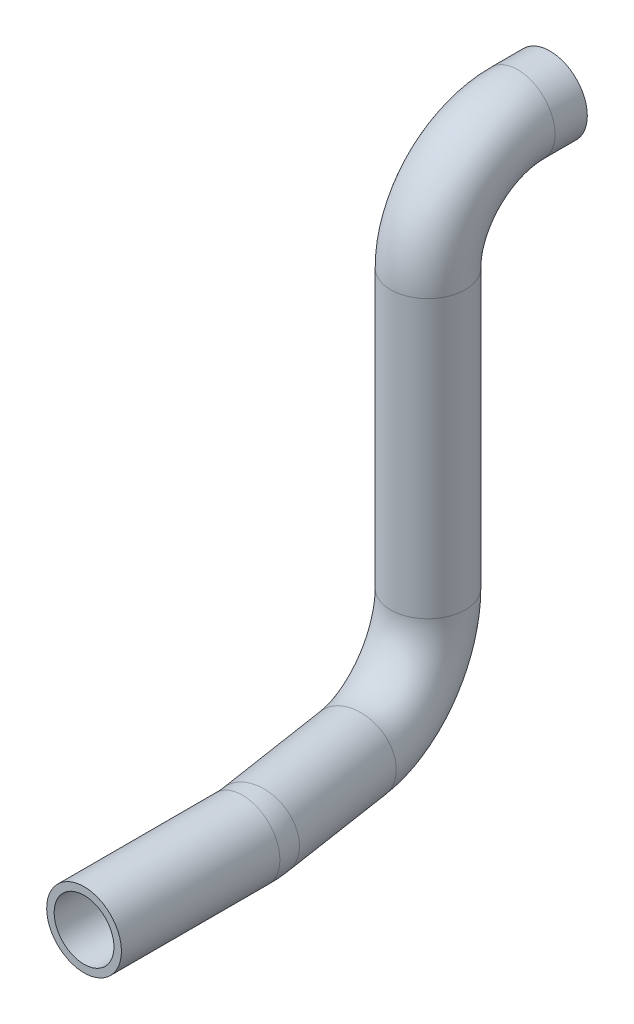
ISO-10303-21;
HEADER;
FILE_DESCRIPTION(('STEP AP214'),'2;1');
FILE_NAME('part.step','',(''),(''),'','','');
FILE_SCHEMA(('AUTOMOTIVE_DESIGN { 1 0 10303 214 1 1 1 1 }'));
ENDSEC;
DATA;
#1=APPLICATION_CONTEXT('core data for automotive mechanical design processes');
#2=APPLICATION_PROTOCOL_DEFINITION('international standard','automotive_design',2000,#1);
#3=PRODUCT_CONTEXT('',#1,'mechanical');
#4=PRODUCT('Part','Part','',(#3));
#5=PRODUCT_RELATED_PRODUCT_CATEGORY('part','',(#4));
#6=PRODUCT_DEFINITION_FORMATION('','',#4);
#7=PRODUCT_DEFINITION_CONTEXT('part definition',#1,'design');
#8=PRODUCT_DEFINITION('design','',#6,#7);
#9=PRODUCT_DEFINITION_SHAPE('','',#8);
#10=(LENGTH_UNIT() NAMED_UNIT(*) SI_UNIT(.MILLI.,.METRE.));
#11=(NAMED_UNIT(*) PLANE_ANGLE_UNIT() SI_UNIT($,.RADIAN.));
#12=(NAMED_UNIT(*) SI_UNIT($,.STERADIAN.) SOLID_ANGLE_UNIT());
#13=UNCERTAINTY_MEASURE_WITH_UNIT(LENGTH_MEASURE(1.E-05),#10,'distance_accuracy_value','');
#14=(GEOMETRIC_REPRESENTATION_CONTEXT(3) GLOBAL_UNCERTAINTY_ASSIGNED_CONTEXT((#13)) GLOBAL_UNIT_ASSIGNED_CONTEXT((#10,
#11,#12)) REPRESENTATION_CONTEXT('',''));
#15=CARTESIAN_POINT('',(0.,0.,0.));
#16=DIRECTION('',(0.,0.,1.));
#17=DIRECTION('',(1.,0.,0.));
#18=AXIS2_PLACEMENT_3D('',#15,#16,#17);
#19=CARTESIAN_POINT('',(-258.005382943833,120.353775534374,36.4238924269701));
#20=DIRECTION('',(0.,0.,1.));
#21=DIRECTION('',(1.,0.,0.));
#22=AXIS2_PLACEMENT_3D('',#19,#20,#21);
#23=CYLINDRICAL_SURFACE('',#22,6.34999999999999);
#24=CARTESIAN_POINT('',(-258.005382943833,120.353775534374,41.914927168532));
#25=DIRECTION('',(0.,0.,1.));
#26=DIRECTION('',(1.,0.,0.));
#27=AXIS2_PLACEMENT_3D('',#24,#25,#26);
#28=CIRCLE('',#27,6.34999999999999);
#29=CARTESIAN_POINT('',(-258.005382943833,126.703775534374,41.914927168532));
#30=VERTEX_POINT('',#29);
#31=EDGE_CURVE('E56',#30,#30,#28,.T.);
#32=ORIENTED_EDGE('',*,*,#31,.F.);
#33=EDGE_LOOP('',(#32));
#34=FACE_BOUND('',#33,.T.);
#35=CARTESIAN_POINT('',(-258.005382943833,120.353775534374,36.4238924269701));
#36=DIRECTION('',(0.,0.,1.));
#37=DIRECTION('',(1.,0.,0.));
#38=AXIS2_PLACEMENT_3D('',#35,#36,#37);
#39=CIRCLE('',#38,6.34999999999999);
#40=CARTESIAN_POINT('',(-251.655382943833,120.353775534374,36.4238924269701));
#41=VERTEX_POINT('',#40);
#42=EDGE_CURVE('E53',#41,#41,#39,.T.);
#43=ORIENTED_EDGE('',*,*,#42,.T.);
#44=EDGE_LOOP('',(#43));
#45=FACE_BOUND('',#44,.T.);
#46=ADVANCED_FACE('F32',(#34,#45),#23,.T.);
#47=CARTESIAN_POINT('',(-258.005382943833,105.113775534374,41.914927168532));
#48=DIRECTION('',(1.,0.,0.));
#49=DIRECTION('',(0.,0.,-1.));
#50=AXIS2_PLACEMENT_3D('',#47,#48,#49);
#51=TOROIDAL_SURFACE('',#50,15.24,6.34999999999999);
#52=CARTESIAN_POINT('',(-258.005382943833,105.113775534374,57.154927168532));
#53=DIRECTION('',(0.,-1.,0.));
#54=DIRECTION('',(1.,0.,0.));
#55=AXIS2_PLACEMENT_3D('',#52,#53,#54);
#56=CIRCLE('',#55,6.34999999999999);
#57=CARTESIAN_POINT('',(-258.005382943833,105.113775534374,63.504927168532));
#58=VERTEX_POINT('',#57);
#59=EDGE_CURVE('E59',#58,#58,#56,.T.);
#60=CARTESIAN_POINT('',(-258.005382943833,105.113775534374,41.914927168532));
#61=DIRECTION('',(1.,0.,0.));
#62=DIRECTION('',(0.,0.,-1.));
#63=AXIS2_PLACEMENT_3D('',#60,#61,#62);
#64=CIRCLE('',#63,21.59);
#65=EDGE_CURVE('',#30,#58,#64,.T.);
#66=ORIENTED_EDGE('',*,*,#31,.T.);
#67=ORIENTED_EDGE('',*,*,#59,.F.);
#68=ORIENTED_EDGE('',*,*,#65,.T.);
#69=ORIENTED_EDGE('',*,*,#65,.F.);
#70=EDGE_LOOP('',(#66,#68,#67,#69));
#71=FACE_BOUND('',#70,.T.);
#72=ADVANCED_FACE('F110',(#71),#51,.T.);
#73=CARTESIAN_POINT('',(-258.005382943833,105.113775534374,57.154927168532));
#74=DIRECTION('',(0.,-1.,0.));
#75=DIRECTION('',(0.,0.,-1.));
#76=AXIS2_PLACEMENT_3D('',#73,#74,#75);
#77=CYLINDRICAL_SURFACE('',#76,6.34999999999999);
#78=CARTESIAN_POINT('',(-258.005382943833,57.9916079515173,57.154927168532));
#79=DIRECTION('',(0.,-1.,0.));
#80=DIRECTION('',(1.,0.,0.));
#81=AXIS2_PLACEMENT_3D('',#78,#79,#80);
#82=CIRCLE('',#81,6.34999999999999);
#83=CARTESIAN_POINT('',(-259.070142182085,57.9916079515173,50.8948322998771));
#84=VERTEX_POINT('',#83);
#85=EDGE_CURVE('E62',#84,#84,#82,.T.);
#86=ORIENTED_EDGE('',*,*,#85,.F.);
#87=EDGE_LOOP('',(#86));
#88=FACE_BOUND('',#87,.T.);
#89=ORIENTED_EDGE('',*,*,#59,.T.);
#90=EDGE_LOOP('',(#89));
#91=FACE_BOUND('',#90,.T.);
#92=ADVANCED_FACE('F114',(#88,#91),#77,.T.);
#93=CARTESIAN_POINT('',(-255.44996077203,57.9916079515173,72.1791548533036));
#94=DIRECTION('',(-0.985841711599188,0.,0.167678620197043));
#95=DIRECTION('',(0.167678620197043,0.,0.985841711599188));
#96=AXIS2_PLACEMENT_3D('',#93,#94,#95);
#97=TOROIDAL_SURFACE('',#96,15.24,6.34999999999999);
#98=CARTESIAN_POINT('',(-255.402275814257,42.754261519815,72.4595115280774));
#99=DIRECTION('',(0.167649424221272,0.0186603052520301,0.985670058166614));
#100=DIRECTION('',(0.971359224953249,0.167649424221272,-0.168389211817443));
#101=AXIS2_PLACEMENT_3D('',#98,#99,#100);
#102=CIRCLE('',#101,6.34999999999999);
#103=CARTESIAN_POINT('',(-255.382407081851,36.4053671732724,72.5763268092332));
#104=VERTEX_POINT('',#103);
#105=EDGE_CURVE('E65',#104,#104,#102,.T.);
#106=CARTESIAN_POINT('',(-255.44996077203,57.9916079515173,72.1791548533036));
#107=DIRECTION('',(-0.985841711599188,0.,0.167678620197043));
#108=DIRECTION('',(0.167678620197043,0.,0.985841711599188));
#109=AXIS2_PLACEMENT_3D('',#106,#107,#108);
#110=CIRCLE('',#109,21.59);
#111=EDGE_CURVE('',#84,#104,#110,.T.);
#112=ORIENTED_EDGE('',*,*,#85,.T.);
#113=ORIENTED_EDGE('',*,*,#105,.F.);
#114=ORIENTED_EDGE('',*,*,#111,.T.);
#115=ORIENTED_EDGE('',*,*,#111,.F.);
#116=EDGE_LOOP('',(#112,#114,#113,#115));
#117=FACE_BOUND('',#116,.T.);
#118=ADVANCED_FACE('F84',(#117),#97,.T.);
#119=CARTESIAN_POINT('',(-255.402275814257,42.754261519815,72.4595115280774));
#120=DIRECTION('',(0.167649424221272,0.0186603052520305,0.985670058166614));
#121=DIRECTION('',(0.985841711599188,0.,-0.167678620197043));
#122=AXIS2_PLACEMENT_3D('',#119,#120,#121);
#123=CYLINDRICAL_SURFACE('',#122,6.34999999999999);
#124=CARTESIAN_POINT('',(-252.02997763815,43.1296169000039,92.2864411750971));
#125=DIRECTION('',(0.167649424221272,0.0186603052520305,0.985670058166614));
#126=DIRECTION('',(0.971359224953249,0.167649424221272,-0.168389211817443));
#127=AXIS2_PLACEMENT_3D('',#124,#125,#126);
#128=CIRCLE('',#127,6.34999999999999);
#129=CARTESIAN_POINT('',(-245.809387345736,43.822002896815,91.2152931716201));
#130=VERTEX_POINT('',#129);
#131=EDGE_CURVE('E67',#130,#130,#128,.T.);
#132=ORIENTED_EDGE('',*,*,#131,.F.);
#133=EDGE_LOOP('',(#132));
#134=FACE_BOUND('',#133,.T.);
#135=ORIENTED_EDGE('',*,*,#105,.T.);
#136=EDGE_LOOP('',(#135));
#137=FACE_BOUND('',#136,.T.);
#138=ADVANCED_FACE('F77',(#134,#137),#123,.T.);
#139=CARTESIAN_POINT('',(-266.959394339942,41.4678905076572,94.8571963834419));
#140=DIRECTION('',(0.110622377081183,-0.9938625104555,0.));
#141=DIRECTION('',(0.9938625104555,0.110622377081183,0.));
#142=AXIS2_PLACEMENT_3D('',#139,#140,#141);
#143=TOROIDAL_SURFACE('',#142,15.24,6.34999999999999);
#144=CARTESIAN_POINT('',(-251.8129296806,43.1537755343745,94.8571963834419));
#145=DIRECTION('',(0.,0.,1.));
#146=DIRECTION('',(0.985576266848081,0.169231859369921,0.));
#147=AXIS2_PLACEMENT_3D('',#144,#145,#146);
#148=CIRCLE('',#147,6.34999999999999);
#149=CARTESIAN_POINT('',(-245.501902739208,43.85622762884,94.8571963834419));
#150=VERTEX_POINT('',#149);
#151=EDGE_CURVE('E36',#150,#150,#148,.T.);
#152=CARTESIAN_POINT('',(-266.959394339942,41.4678905076572,94.8571963834419));
#153=DIRECTION('',(0.110622377081183,-0.9938625104555,0.));
#154=DIRECTION('',(0.9938625104555,0.110622377081183,0.));
#155=AXIS2_PLACEMENT_3D('',#152,#153,#154);
#156=CIRCLE('',#155,21.59);
#157=EDGE_CURVE('',#130,#150,#156,.T.);
#158=ORIENTED_EDGE('',*,*,#131,.T.);
#159=ORIENTED_EDGE('',*,*,#151,.F.);
#160=ORIENTED_EDGE('',*,*,#157,.T.);
#161=ORIENTED_EDGE('',*,*,#157,.F.);
#162=EDGE_LOOP('',(#158,#160,#159,#161));
#163=FACE_BOUND('',#162,.T.);
#164=ADVANCED_FACE('F75',(#163),#143,.T.);
#165=CARTESIAN_POINT('',(-251.8129296806,43.1537755343745,94.8571963834419));
#166=DIRECTION('',(0.,0.,1.));
#167=DIRECTION('',(1.,0.,0.));
#168=AXIS2_PLACEMENT_3D('',#165,#166,#167);
#169=CYLINDRICAL_SURFACE('',#168,6.34999999999999);
#170=CARTESIAN_POINT('',(-251.8129296806,43.1537755343745,121.78889242697));
#171=DIRECTION('',(0.,0.,1.));
#172=DIRECTION('',(0.985576266848081,0.169231859369921,0.));
#173=AXIS2_PLACEMENT_3D('',#170,#171,#172);
#174=CIRCLE('',#173,6.34999999999999);
#175=CARTESIAN_POINT('',(-245.554520386115,44.2283978413735,121.78889242697));
#176=VERTEX_POINT('',#175);
#177=EDGE_CURVE('E49',#176,#176,#174,.T.);
#178=ORIENTED_EDGE('',*,*,#177,.F.);
#179=EDGE_LOOP('',(#178));
#180=FACE_BOUND('',#179,.T.);
#181=ORIENTED_EDGE('',*,*,#151,.T.);
#182=EDGE_LOOP('',(#181));
#183=FACE_BOUND('',#182,.T.);
#184=ADVANCED_FACE('F34',(#180,#183),#169,.T.);
#185=CARTESIAN_POINT('',(-258.005382943833,120.353775534374,36.4238924269701));
#186=DIRECTION('',(0.,0.,1.));
#187=DIRECTION('',(1.,0.,0.));
#188=AXIS2_PLACEMENT_3D('',#185,#186,#187);
#189=PLANE('',#188);
#190=CARTESIAN_POINT('',(-258.005382943833,120.353775534374,36.4238924269701));
#191=DIRECTION('',(0.,0.,1.));
#192=DIRECTION('',(1.,0.,0.));
#193=AXIS2_PLACEMENT_3D('',#190,#191,#192);
#194=CIRCLE('',#193,5.08000000000002);
#195=CARTESIAN_POINT('',(-252.925382943833,120.353775534374,36.4238924269701));
#196=VERTEX_POINT('',#195);
#197=EDGE_CURVE('E52',#196,#196,#194,.F.);
#198=ORIENTED_EDGE('',*,*,#197,.F.);
#199=EDGE_LOOP('',(#198));
#200=FACE_BOUND('',#199,.T.);
#201=ORIENTED_EDGE('',*,*,#42,.F.);
#202=EDGE_LOOP('',(#201));
#203=FACE_BOUND('',#202,.T.);
#204=ADVANCED_FACE('F82',(#200,#203),#189,.F.);
#205=CARTESIAN_POINT('',(-251.8129296806,43.1537755343745,121.78889242697));
#206=DIRECTION('',(0.,0.,1.));
#207=DIRECTION('',(0.985576266848081,0.169231859369921,0.));
#208=AXIS2_PLACEMENT_3D('',#205,#206,#207);
#209=PLANE('',#208);
#210=CARTESIAN_POINT('',(-251.8129296806,43.1537755343745,121.78889242697));
#211=DIRECTION('',(0.,0.,1.));
#212=DIRECTION('',(0.985576266848081,0.169231859369921,0.));
#213=AXIS2_PLACEMENT_3D('',#210,#211,#212);
#214=CIRCLE('',#213,5.08000000000002);
#215=CARTESIAN_POINT('',(-246.806202245012,44.0134733799737,121.78889242697));
#216=VERTEX_POINT('',#215);
#217=EDGE_CURVE('E10',#216,#216,#214,.F.);
#218=ORIENTED_EDGE('',*,*,#217,.T.);
#219=EDGE_LOOP('',(#218));
#220=FACE_BOUND('',#219,.T.);
#221=ORIENTED_EDGE('',*,*,#177,.T.);
#222=EDGE_LOOP('',(#221));
#223=FACE_BOUND('',#222,.T.);
#224=ADVANCED_FACE('F101',(#220,#223),#209,.T.);
#225=CARTESIAN_POINT('',(-258.005382943833,120.353775534374,36.4238924269701));
#226=DIRECTION('',(0.,0.,1.));
#227=DIRECTION('',(1.,0.,0.));
#228=AXIS2_PLACEMENT_3D('',#225,#226,#227);
#229=CYLINDRICAL_SURFACE('',#228,5.08000000000002);
#230=CARTESIAN_POINT('',(-258.005382943833,120.353775534374,41.914927168532));
#231=DIRECTION('',(0.,0.,1.));
#232=DIRECTION('',(1.,0.,0.));
#233=AXIS2_PLACEMENT_3D('',#230,#231,#232);
#234=CIRCLE('',#233,5.08000000000002);
#235=CARTESIAN_POINT('',(-258.005382943833,125.433775534374,41.914927168532));
#236=VERTEX_POINT('',#235);
#237=EDGE_CURVE('E237',#236,#236,#234,.F.);
#238=ORIENTED_EDGE('',*,*,#237,.F.);
#239=EDGE_LOOP('',(#238));
#240=FACE_BOUND('',#239,.T.);
#241=ORIENTED_EDGE('',*,*,#197,.T.);
#242=EDGE_LOOP('',(#241));
#243=FACE_BOUND('',#242,.T.);
#244=ADVANCED_FACE('F104',(#240,#243),#229,.F.);
#245=CARTESIAN_POINT('',(-258.005382943833,105.113775534374,41.914927168532));
#246=DIRECTION('',(1.,0.,0.));
#247=DIRECTION('',(0.,0.,-1.));
#248=AXIS2_PLACEMENT_3D('',#245,#246,#247);
#249=TOROIDAL_SURFACE('',#248,15.24,5.08000000000002);
#250=CARTESIAN_POINT('',(-258.005382943833,105.113775534374,57.154927168532));
#251=DIRECTION('',(0.,-1.,0.));
#252=DIRECTION('',(1.,0.,0.));
#253=AXIS2_PLACEMENT_3D('',#250,#251,#252);
#254=CIRCLE('',#253,5.08000000000002);
#255=CARTESIAN_POINT('',(-258.005382943833,105.113775534374,62.234927168532));
#256=VERTEX_POINT('',#255);
#257=EDGE_CURVE('E232',#256,#256,#254,.F.);
#258=CARTESIAN_POINT('',(-258.005382943833,105.113775534374,41.914927168532));
#259=DIRECTION('',(1.,0.,0.));
#260=DIRECTION('',(0.,0.,-1.));
#261=AXIS2_PLACEMENT_3D('',#258,#259,#260);
#262=CIRCLE('',#261,20.32);
#263=EDGE_CURVE('',#236,#256,#262,.T.);
#264=ORIENTED_EDGE('',*,*,#237,.T.);
#265=ORIENTED_EDGE('',*,*,#257,.F.);
#266=ORIENTED_EDGE('',*,*,#263,.T.);
#267=ORIENTED_EDGE('',*,*,#263,.F.);
#268=EDGE_LOOP('',(#264,#266,#265,#267));
#269=FACE_BOUND('',#268,.T.);
#270=ADVANCED_FACE('F171',(#269),#249,.F.);
#271=CARTESIAN_POINT('',(-258.005382943833,105.113775534374,57.154927168532));
#272=DIRECTION('',(0.,-1.,0.));
#273=DIRECTION('',(0.,0.,-1.));
#274=AXIS2_PLACEMENT_3D('',#271,#272,#273);
#275=CYLINDRICAL_SURFACE('',#274,5.08000000000002);
#276=CARTESIAN_POINT('',(-258.005382943833,57.9916079515173,57.154927168532));
#277=DIRECTION('',(0.,-1.,0.));
#278=DIRECTION('',(1.,0.,0.));
#279=AXIS2_PLACEMENT_3D('',#276,#277,#278);
#280=CIRCLE('',#279,5.08000000000002);
#281=CARTESIAN_POINT('',(-258.857190334434,57.9916079515173,52.1468512736081));
#282=VERTEX_POINT('',#281);
#283=EDGE_CURVE('E229',#282,#282,#280,.F.);
#284=ORIENTED_EDGE('',*,*,#283,.F.);
#285=EDGE_LOOP('',(#284));
#286=FACE_BOUND('',#285,.T.);
#287=ORIENTED_EDGE('',*,*,#257,.T.);
#288=EDGE_LOOP('',(#287));
#289=FACE_BOUND('',#288,.T.);
#290=ADVANCED_FACE('F181',(#286,#289),#275,.F.);
#291=CARTESIAN_POINT('',(-255.44996077203,57.9916079515173,72.1791548533036));
#292=DIRECTION('',(-0.985841711599188,0.,0.167678620197043));
#293=DIRECTION('',(0.167678620197043,0.,0.985841711599188));
#294=AXIS2_PLACEMENT_3D('',#291,#292,#293);
#295=TOROIDAL_SURFACE('',#294,15.24,5.08000000000002);
#296=CARTESIAN_POINT('',(-255.402275814257,42.754261519815,72.4595115280774));
#297=DIRECTION('',(0.167649424221272,0.0186603052520301,0.985670058166614));
#298=DIRECTION('',(0.971359224953249,0.167649424221272,-0.168389211817443));
#299=AXIS2_PLACEMENT_3D('',#296,#297,#298);
#300=CIRCLE('',#299,5.08000000000002);
#301=CARTESIAN_POINT('',(-255.386380828332,37.6751460425809,72.552963753002));
#302=VERTEX_POINT('',#301);
#303=EDGE_CURVE('E228',#302,#302,#300,.F.);
#304=CARTESIAN_POINT('',(-255.44996077203,57.9916079515173,72.1791548533036));
#305=DIRECTION('',(-0.985841711599188,0.,0.167678620197043));
#306=DIRECTION('',(0.167678620197043,0.,0.985841711599188));
#307=AXIS2_PLACEMENT_3D('',#304,#305,#306);
#308=CIRCLE('',#307,20.32);
#309=EDGE_CURVE('',#282,#302,#308,.T.);
#310=ORIENTED_EDGE('',*,*,#283,.T.);
#311=ORIENTED_EDGE('',*,*,#303,.F.);
#312=ORIENTED_EDGE('',*,*,#309,.T.);
#313=ORIENTED_EDGE('',*,*,#309,.F.);
#314=EDGE_LOOP('',(#310,#312,#311,#313));
#315=FACE_BOUND('',#314,.T.);
#316=ADVANCED_FACE('F191',(#315),#295,.F.);
#317=CARTESIAN_POINT('',(-255.402275814257,42.754261519815,72.4595115280774));
#318=DIRECTION('',(0.167649424221272,0.0186603052520305,0.985670058166614));
#319=DIRECTION('',(0.985841711599188,0.,-0.167678620197043));
#320=AXIS2_PLACEMENT_3D('',#317,#318,#319);
#321=CYLINDRICAL_SURFACE('',#320,5.08000000000002);
#322=CARTESIAN_POINT('',(-252.02997763815,43.1296169000039,92.2864411750971));
#323=DIRECTION('',(0.167649424221272,0.0186603052520305,0.985670058166614));
#324=DIRECTION('',(0.971359224953249,0.167649424221272,-0.168389211817443));
#325=AXIS2_PLACEMENT_3D('',#322,#323,#324);
#326=CIRCLE('',#325,5.08000000000002);
#327=CARTESIAN_POINT('',(-247.053505404219,43.6835256974528,91.4295227723155));
#328=VERTEX_POINT('',#327);
#329=EDGE_CURVE('E45',#328,#328,#326,.F.);
#330=ORIENTED_EDGE('',*,*,#329,.F.);
#331=EDGE_LOOP('',(#330));
#332=FACE_BOUND('',#331,.T.);
#333=ORIENTED_EDGE('',*,*,#303,.T.);
#334=EDGE_LOOP('',(#333));
#335=FACE_BOUND('',#334,.T.);
#336=ADVANCED_FACE('F95',(#332,#335),#321,.F.);
#337=CARTESIAN_POINT('',(-266.959394339942,41.4678905076572,94.8571963834419));
#338=DIRECTION('',(0.110622377081183,-0.9938625104555,0.));
#339=DIRECTION('',(0.9938625104555,0.110622377081183,0.));
#340=AXIS2_PLACEMENT_3D('',#337,#338,#339);
#341=TOROIDAL_SURFACE('',#340,15.24,5.08000000000002);
#342=CARTESIAN_POINT('',(-251.8129296806,43.1537755343745,94.8571963834419));
#343=DIRECTION('',(0.,0.,1.));
#344=DIRECTION('',(0.985576266848081,0.169231859369921,0.));
#345=AXIS2_PLACEMENT_3D('',#342,#343,#344);
#346=CIRCLE('',#345,5.08000000000002);
#347=CARTESIAN_POINT('',(-246.764108127486,43.7157372099469,94.8571963834419));
#348=VERTEX_POINT('',#347);
#349=EDGE_CURVE('E40',#348,#348,#346,.F.);
#350=CARTESIAN_POINT('',(-266.959394339942,41.4678905076572,94.8571963834419));
#351=DIRECTION('',(0.110622377081183,-0.9938625104555,0.));
#352=DIRECTION('',(0.9938625104555,0.110622377081183,0.));
#353=AXIS2_PLACEMENT_3D('',#350,#351,#352);
#354=CIRCLE('',#353,20.32);
#355=EDGE_CURVE('',#328,#348,#354,.T.);
#356=ORIENTED_EDGE('',*,*,#329,.T.);
#357=ORIENTED_EDGE('',*,*,#349,.F.);
#358=ORIENTED_EDGE('',*,*,#355,.T.);
#359=ORIENTED_EDGE('',*,*,#355,.F.);
#360=EDGE_LOOP('',(#356,#358,#357,#359));
#361=FACE_BOUND('',#360,.T.);
#362=ADVANCED_FACE('F89',(#361),#341,.F.);
#363=CARTESIAN_POINT('',(-251.8129296806,43.1537755343745,94.8571963834419));
#364=DIRECTION('',(0.,0.,1.));
#365=DIRECTION('',(1.,0.,0.));
#366=AXIS2_PLACEMENT_3D('',#363,#364,#365);
#367=CYLINDRICAL_SURFACE('',#366,5.08000000000002);
#368=ORIENTED_EDGE('',*,*,#217,.F.);
#369=EDGE_LOOP('',(#368));
#370=FACE_BOUND('',#369,.T.);
#371=ORIENTED_EDGE('',*,*,#349,.T.);
#372=EDGE_LOOP('',(#371));
#373=FACE_BOUND('',#372,.T.);
#374=ADVANCED_FACE('F87',(#370,#373),#367,.F.);
#375=CLOSED_SHELL('',(#46,#72,#92,#118,#138,#164,#184,#204,#224,#244,#270,#290,#316,#336,#362,#374));
#376=MANIFOLD_SOLID_BREP('B2',#375);
#377=ADVANCED_BREP_SHAPE_REPRESENTATION('',(#18,#376),#14);
#378=SHAPE_DEFINITION_REPRESENTATION(#9,#377);
ENDSEC;
END-ISO-10303-21;
